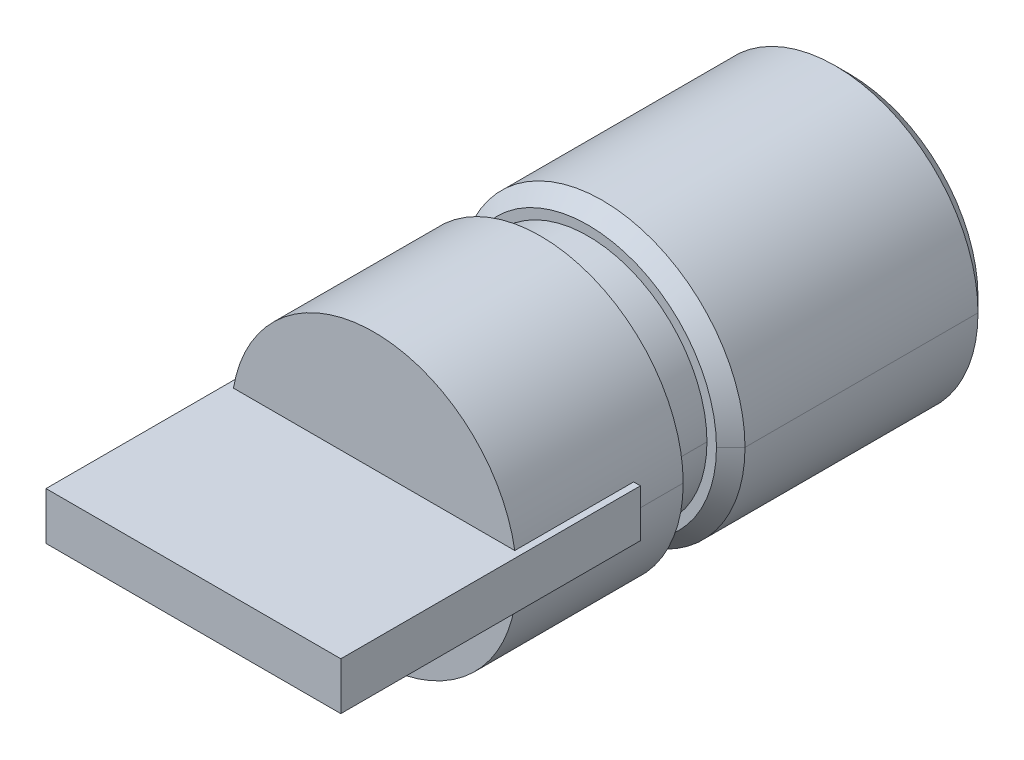
ISO-10303-21;
HEADER;
FILE_DESCRIPTION(('STEP AP214'),'2;1');
FILE_NAME('part.step','',(''),(''),'','','');
FILE_SCHEMA(('AUTOMOTIVE_DESIGN { 1 0 10303 214 1 1 1 1 }'));
ENDSEC;
DATA;
#1=APPLICATION_CONTEXT('core data for automotive mechanical design processes');
#2=APPLICATION_PROTOCOL_DEFINITION('international standard','automotive_design',2000,#1);
#3=PRODUCT_CONTEXT('',#1,'mechanical');
#4=PRODUCT('Part','Part','',(#3));
#5=PRODUCT_RELATED_PRODUCT_CATEGORY('part','',(#4));
#6=PRODUCT_DEFINITION_FORMATION('','',#4);
#7=PRODUCT_DEFINITION_CONTEXT('part definition',#1,'design');
#8=PRODUCT_DEFINITION('design','',#6,#7);
#9=PRODUCT_DEFINITION_SHAPE('','',#8);
#10=(LENGTH_UNIT() NAMED_UNIT(*) SI_UNIT(.MILLI.,.METRE.));
#11=(NAMED_UNIT(*) PLANE_ANGLE_UNIT() SI_UNIT($,.RADIAN.));
#12=(NAMED_UNIT(*) SI_UNIT($,.STERADIAN.) SOLID_ANGLE_UNIT());
#13=UNCERTAINTY_MEASURE_WITH_UNIT(LENGTH_MEASURE(1.E-05),#10,'distance_accuracy_value','');
#14=(GEOMETRIC_REPRESENTATION_CONTEXT(3) GLOBAL_UNCERTAINTY_ASSIGNED_CONTEXT((#13)) GLOBAL_UNIT_ASSIGNED_CONTEXT((#10,
#11,#12)) REPRESENTATION_CONTEXT('',''));
#15=CARTESIAN_POINT('',(0.,0.,0.));
#16=DIRECTION('',(0.,0.,1.));
#17=DIRECTION('',(1.,0.,0.));
#18=AXIS2_PLACEMENT_3D('',#15,#16,#17);
#19=CARTESIAN_POINT('',(0.,0.,0.3));
#20=DIRECTION('',(0.,0.,1.));
#21=DIRECTION('',(1.,0.,0.));
#22=AXIS2_PLACEMENT_3D('',#19,#20,#21);
#23=CONICAL_SURFACE('',#22,3.,0.785398163397448);
#24=DIRECTION('',(-0.707106781186547,0.,0.707106781186548));
#25=VECTOR('',#24,1.);
#26=CARTESIAN_POINT('',(-3.,0.,0.3));
#27=LINE('',#26,#25);
#28=CARTESIAN_POINT('',(-2.7,0.,0.));
#29=VERTEX_POINT('',#28);
#30=CARTESIAN_POINT('',(-3.,0.,0.3));
#31=VERTEX_POINT('',#30);
#32=EDGE_CURVE('P0_E348',#29,#31,#27,.T.);
#33=ORIENTED_EDGE('',*,*,#32,.F.);
#34=CARTESIAN_POINT('',(0.,0.,0.));
#35=DIRECTION('',(0.,0.,-1.));
#36=DIRECTION('',(1.,0.,0.));
#37=AXIS2_PLACEMENT_3D('',#34,#35,#36);
#38=CIRCLE('',#37,2.7);
#39=CARTESIAN_POINT('',(2.7,0.,0.));
#40=VERTEX_POINT('',#39);
#41=EDGE_CURVE('P0_E279',#40,#29,#38,.T.);
#42=ORIENTED_EDGE('',*,*,#41,.F.);
#43=DIRECTION('',(0.707106781186547,0.,0.707106781186548));
#44=VECTOR('',#43,1.);
#45=CARTESIAN_POINT('',(3.,0.,0.3));
#46=LINE('',#45,#44);
#47=CARTESIAN_POINT('',(3.,0.,0.3));
#48=VERTEX_POINT('',#47);
#49=EDGE_CURVE('P0_E194',#40,#48,#46,.T.);
#50=ORIENTED_EDGE('',*,*,#49,.T.);
#51=CARTESIAN_POINT('',(0.,0.,0.3));
#52=DIRECTION('',(0.,0.,1.));
#53=DIRECTION('',(1.,0.,0.));
#54=AXIS2_PLACEMENT_3D('',#51,#52,#53);
#55=CIRCLE('',#54,3.);
#56=EDGE_CURVE('P0_E166',#31,#48,#55,.T.);
#57=ORIENTED_EDGE('',*,*,#56,.F.);
#58=EDGE_LOOP('',(#33,#42,#50,#57));
#59=FACE_BOUND('',#58,.T.);
#60=ADVANCED_FACE('P0_F17',(#59),#23,.T.);
#61=CARTESIAN_POINT('',(0.,0.,5.5));
#62=DIRECTION('',(0.,0.,-1.));
#63=DIRECTION('',(-1.,0.,0.));
#64=AXIS2_PLACEMENT_3D('',#61,#62,#63);
#65=CONICAL_SURFACE('',#64,2.7,0.785398163397449);
#66=DIRECTION('',(0.707106781186548,0.,-0.707106781186547));
#67=VECTOR('',#66,1.);
#68=CARTESIAN_POINT('',(2.7,0.,5.5));
#69=LINE('',#68,#67);
#70=CARTESIAN_POINT('',(2.7,0.,5.5));
#71=VERTEX_POINT('',#70);
#72=CARTESIAN_POINT('',(3.,0.,5.2));
#73=VERTEX_POINT('',#72);
#74=EDGE_CURVE('P0_E157',#71,#73,#69,.T.);
#75=ORIENTED_EDGE('',*,*,#74,.F.);
#76=CARTESIAN_POINT('',(0.,0.,5.5));
#77=DIRECTION('',(0.,0.,1.));
#78=DIRECTION('',(1.,0.,0.));
#79=AXIS2_PLACEMENT_3D('',#76,#77,#78);
#80=CIRCLE('',#79,2.7);
#81=CARTESIAN_POINT('',(-2.7,0.,5.5));
#82=VERTEX_POINT('',#81);
#83=EDGE_CURVE('P0_E273',#82,#71,#80,.T.);
#84=ORIENTED_EDGE('',*,*,#83,.F.);
#85=DIRECTION('',(-0.707106781186548,0.,-0.707106781186547));
#86=VECTOR('',#85,1.);
#87=CARTESIAN_POINT('',(-2.7,0.,5.5));
#88=LINE('',#87,#86);
#89=CARTESIAN_POINT('',(-3.,0.,5.2));
#90=VERTEX_POINT('',#89);
#91=EDGE_CURVE('P0_E160',#82,#90,#88,.T.);
#92=ORIENTED_EDGE('',*,*,#91,.T.);
#93=CARTESIAN_POINT('',(0.,0.,5.2));
#94=DIRECTION('',(0.,0.,-1.));
#95=DIRECTION('',(1.,0.,0.));
#96=AXIS2_PLACEMENT_3D('',#93,#94,#95);
#97=CIRCLE('',#96,3.);
#98=EDGE_CURVE('P0_E153',#73,#90,#97,.T.);
#99=ORIENTED_EDGE('',*,*,#98,.F.);
#100=EDGE_LOOP('',(#75,#84,#92,#99));
#101=FACE_BOUND('',#100,.T.);
#102=ADVANCED_FACE('P0_F155',(#101),#65,.T.);
#103=CARTESIAN_POINT('',(0.,0.,7.5));
#104=DIRECTION('',(0.,0.,1.));
#105=DIRECTION('',(1.,0.,0.));
#106=AXIS2_PLACEMENT_3D('',#103,#104,#105);
#107=PLANE('',#106);
#108=CARTESIAN_POINT('',(0.,0.,7.5));
#109=DIRECTION('',(0.,0.,1.));
#110=DIRECTION('',(1.,0.,0.));
#111=AXIS2_PLACEMENT_3D('',#108,#109,#110);
#112=CIRCLE('',#111,3.);
#113=CARTESIAN_POINT('',(-2.95803989154981,0.5,7.5));
#114=VERTEX_POINT('',#113);
#115=CARTESIAN_POINT('',(-3.,0.,7.5));
#116=VERTEX_POINT('',#115);
#117=EDGE_CURVE('P0_E230',#114,#116,#112,.T.);
#118=ORIENTED_EDGE('',*,*,#117,.T.);
#119=CARTESIAN_POINT('',(0.,0.,7.5));
#120=DIRECTION('',(0.,0.,1.));
#121=DIRECTION('',(1.,0.,0.));
#122=AXIS2_PLACEMENT_3D('',#119,#120,#121);
#123=CIRCLE('',#122,3.);
#124=CARTESIAN_POINT('',(-2.95803989154981,-0.5,7.5));
#125=VERTEX_POINT('',#124);
#126=EDGE_CURVE('P0_E268',#116,#125,#123,.T.);
#127=ORIENTED_EDGE('',*,*,#126,.T.);
#128=DIRECTION('',(1.,0.,0.));
#129=VECTOR('',#128,1.);
#130=CARTESIAN_POINT('',(-2.95803989154981,-0.5,7.5));
#131=LINE('',#130,#129);
#132=CARTESIAN_POINT('',(2.95803989154981,-0.5,7.5));
#133=VERTEX_POINT('',#132);
#134=EDGE_CURVE('P0_E11',#125,#133,#131,.T.);
#135=ORIENTED_EDGE('',*,*,#134,.T.);
#136=CARTESIAN_POINT('',(0.,0.,7.5));
#137=DIRECTION('',(0.,0.,1.));
#138=DIRECTION('',(1.,0.,0.));
#139=AXIS2_PLACEMENT_3D('',#136,#137,#138);
#140=CIRCLE('',#139,3.);
#141=CARTESIAN_POINT('',(3.,0.,7.5));
#142=VERTEX_POINT('',#141);
#143=EDGE_CURVE('P0_E288',#133,#142,#140,.T.);
#144=ORIENTED_EDGE('',*,*,#143,.T.);
#145=CARTESIAN_POINT('',(0.,0.,7.5));
#146=DIRECTION('',(0.,0.,1.));
#147=DIRECTION('',(1.,0.,0.));
#148=AXIS2_PLACEMENT_3D('',#145,#146,#147);
#149=CIRCLE('',#148,3.);
#150=CARTESIAN_POINT('',(2.95803989154981,0.5,7.5));
#151=VERTEX_POINT('',#150);
#152=EDGE_CURVE('P0_E225',#142,#151,#149,.T.);
#153=ORIENTED_EDGE('',*,*,#152,.T.);
#154=DIRECTION('',(-1.,0.,0.));
#155=VECTOR('',#154,1.);
#156=CARTESIAN_POINT('',(-2.95803989154981,0.5,7.5));
#157=LINE('',#156,#155);
#158=EDGE_CURVE('P0_E25',#151,#114,#157,.T.);
#159=ORIENTED_EDGE('',*,*,#158,.T.);
#160=EDGE_LOOP('',(#118,#127,#135,#144,#153,#159));
#161=FACE_BOUND('',#160,.T.);
#162=ADVANCED_FACE('P0_F309',(#161),#107,.T.);
#163=CARTESIAN_POINT('',(-2.95803989154981,-0.5,7.5));
#164=DIRECTION('',(0.,-1.,0.));
#165=DIRECTION('',(0.,0.,-1.));
#166=AXIS2_PLACEMENT_3D('',#163,#164,#165);
#167=PLANE('',#166);
#168=DIRECTION('',(1.,0.,0.));
#169=VECTOR('',#168,1.);
#170=CARTESIAN_POINT('',(-2.95803989154981,-0.5,10.));
#171=LINE('',#170,#169);
#172=CARTESIAN_POINT('',(-2.95803989154981,-0.5,10.));
#173=VERTEX_POINT('',#172);
#174=CARTESIAN_POINT('',(2.95803989154981,-0.5,10.));
#175=VERTEX_POINT('',#174);
#176=EDGE_CURVE('P0_E46',#173,#175,#171,.T.);
#177=ORIENTED_EDGE('',*,*,#176,.T.);
#178=DIRECTION('',(0.,0.,1.));
#179=VECTOR('',#178,1.);
#180=CARTESIAN_POINT('',(2.95803989154981,-0.5,7.5));
#181=LINE('',#180,#179);
#182=EDGE_CURVE('P0_E294',#133,#175,#181,.T.);
#183=ORIENTED_EDGE('',*,*,#182,.F.);
#184=ORIENTED_EDGE('',*,*,#134,.F.);
#185=DIRECTION('',(0.,0.,1.));
#186=VECTOR('',#185,1.);
#187=CARTESIAN_POINT('',(-2.95803989154981,-0.5,7.5));
#188=LINE('',#187,#186);
#189=EDGE_CURVE('P0_E266',#125,#173,#188,.T.);
#190=ORIENTED_EDGE('',*,*,#189,.T.);
#191=EDGE_LOOP('',(#177,#183,#184,#190));
#192=FACE_BOUND('',#191,.T.);
#193=ADVANCED_FACE('P0_F326',(#192),#167,.F.);
#194=CARTESIAN_POINT('',(-2.95803989154981,0.5,7.5));
#195=DIRECTION('',(0.,1.,0.));
#196=DIRECTION('',(1.,0.,0.));
#197=AXIS2_PLACEMENT_3D('',#194,#195,#196);
#198=PLANE('',#197);
#199=DIRECTION('',(-1.,0.,0.));
#200=VECTOR('',#199,1.);
#201=CARTESIAN_POINT('',(-2.95803989154981,0.5,10.));
#202=LINE('',#201,#200);
#203=CARTESIAN_POINT('',(2.95803989154981,0.5,10.));
#204=VERTEX_POINT('',#203);
#205=CARTESIAN_POINT('',(-2.95803989154981,0.5,10.));
#206=VERTEX_POINT('',#205);
#207=EDGE_CURVE('P0_E167',#204,#206,#202,.T.);
#208=ORIENTED_EDGE('',*,*,#207,.T.);
#209=DIRECTION('',(0.,0.,1.));
#210=VECTOR('',#209,1.);
#211=CARTESIAN_POINT('',(-2.95803989154981,0.5,7.5));
#212=LINE('',#211,#210);
#213=EDGE_CURVE('P0_E243',#114,#206,#212,.T.);
#214=ORIENTED_EDGE('',*,*,#213,.F.);
#215=ORIENTED_EDGE('',*,*,#158,.F.);
#216=DIRECTION('',(0.,0.,1.));
#217=VECTOR('',#216,1.);
#218=CARTESIAN_POINT('',(2.95803989154981,0.5,7.5));
#219=LINE('',#218,#217);
#220=EDGE_CURVE('P0_E207',#151,#204,#219,.T.);
#221=ORIENTED_EDGE('',*,*,#220,.T.);
#222=EDGE_LOOP('',(#208,#214,#215,#221));
#223=FACE_BOUND('',#222,.T.);
#224=ADVANCED_FACE('P0_F315',(#223),#198,.F.);
#225=CARTESIAN_POINT('',(0.,0.,2.));
#226=DIRECTION('',(0.,0.,-1.));
#227=DIRECTION('',(0.,-1.,0.));
#228=AXIS2_PLACEMENT_3D('',#225,#226,#227);
#229=PLANE('',#228);
#230=CARTESIAN_POINT('',(0.,0.,2.));
#231=DIRECTION('',(0.,0.,-1.));
#232=DIRECTION('',(-1.,0.,0.));
#233=AXIS2_PLACEMENT_3D('',#230,#231,#232);
#234=CIRCLE('',#233,1.75);
#235=CARTESIAN_POINT('',(-1.75,0.,2.));
#236=VERTEX_POINT('',#235);
#237=CARTESIAN_POINT('',(1.75,0.,2.));
#238=VERTEX_POINT('',#237);
#239=EDGE_CURVE('P0_E302',#236,#238,#234,.T.);
#240=ORIENTED_EDGE('',*,*,#239,.T.);
#241=CARTESIAN_POINT('',(0.,0.,2.));
#242=DIRECTION('',(0.,0.,-1.));
#243=DIRECTION('',(-1.,0.,0.));
#244=AXIS2_PLACEMENT_3D('',#241,#242,#243);
#245=CIRCLE('',#244,1.75);
#246=EDGE_CURVE('P0_E204',#238,#236,#245,.T.);
#247=ORIENTED_EDGE('',*,*,#246,.T.);
#248=EDGE_LOOP('',(#240,#247));
#249=FACE_BOUND('',#248,.T.);
#250=ADVANCED_FACE('P0_F509',(#249),#229,.T.);
#251=CARTESIAN_POINT('',(0.,0.,2.));
#252=DIRECTION('',(0.,0.,-1.));
#253=DIRECTION('',(-1.,0.,0.));
#254=AXIS2_PLACEMENT_3D('',#251,#252,#253);
#255=CYLINDRICAL_SURFACE('',#254,1.75);
#256=DIRECTION('',(0.,0.,-1.));
#257=VECTOR('',#256,1.);
#258=CARTESIAN_POINT('',(1.75,0.,2.));
#259=LINE('',#258,#257);
#260=CARTESIAN_POINT('',(1.75,0.,0.));
#261=VERTEX_POINT('',#260);
#262=EDGE_CURVE('P0_E199',#238,#261,#259,.T.);
#263=ORIENTED_EDGE('',*,*,#262,.F.);
#264=ORIENTED_EDGE('',*,*,#239,.F.);
#265=DIRECTION('',(0.,0.,-1.));
#266=VECTOR('',#265,1.);
#267=CARTESIAN_POINT('',(-1.75,0.,2.));
#268=LINE('',#267,#266);
#269=CARTESIAN_POINT('',(-1.75,0.,0.));
#270=VERTEX_POINT('',#269);
#271=EDGE_CURVE('P0_E219',#236,#270,#268,.T.);
#272=ORIENTED_EDGE('',*,*,#271,.T.);
#273=CARTESIAN_POINT('',(0.,0.,0.));
#274=DIRECTION('',(0.,0.,-1.));
#275=DIRECTION('',(-1.,0.,0.));
#276=AXIS2_PLACEMENT_3D('',#273,#274,#275);
#277=CIRCLE('',#276,1.75);
#278=EDGE_CURVE('P0_E282',#270,#261,#277,.T.);
#279=ORIENTED_EDGE('',*,*,#278,.T.);
#280=EDGE_LOOP('',(#263,#264,#272,#279));
#281=FACE_BOUND('',#280,.T.);
#282=ADVANCED_FACE('P0_F513',(#281),#255,.F.);
#283=CARTESIAN_POINT('',(0.,0.,6.5));
#284=DIRECTION('',(0.,0.,1.));
#285=DIRECTION('',(1.,0.,0.));
#286=AXIS2_PLACEMENT_3D('',#283,#284,#285);
#287=PLANE('',#286);
#288=CARTESIAN_POINT('',(0.,0.,6.5));
#289=DIRECTION('',(0.,0.,1.));
#290=DIRECTION('',(1.,0.,0.));
#291=AXIS2_PLACEMENT_3D('',#288,#289,#290);
#292=CIRCLE('',#291,2.5);
#293=CARTESIAN_POINT('',(-2.5,0.,6.5));
#294=VERTEX_POINT('',#293);
#295=CARTESIAN_POINT('',(2.5,0.,6.5));
#296=VERTEX_POINT('',#295);
#297=EDGE_CURVE('P0_E285',#294,#296,#292,.T.);
#298=ORIENTED_EDGE('',*,*,#297,.T.);
#299=CARTESIAN_POINT('',(0.,0.,6.5));
#300=DIRECTION('',(0.,0.,1.));
#301=DIRECTION('',(1.,0.,0.));
#302=AXIS2_PLACEMENT_3D('',#299,#300,#301);
#303=CIRCLE('',#302,2.5);
#304=EDGE_CURVE('P0_E211',#296,#294,#303,.T.);
#305=ORIENTED_EDGE('',*,*,#304,.T.);
#306=EDGE_LOOP('',(#298,#305));
#307=FACE_BOUND('',#306,.T.);
#308=CARTESIAN_POINT('',(0.,0.,6.5));
#309=DIRECTION('',(0.,0.,1.));
#310=DIRECTION('',(1.,0.,0.));
#311=AXIS2_PLACEMENT_3D('',#308,#309,#310);
#312=CIRCLE('',#311,3.);
#313=CARTESIAN_POINT('',(-3.,0.,6.5));
#314=VERTEX_POINT('',#313);
#315=CARTESIAN_POINT('',(3.,0.,6.5));
#316=VERTEX_POINT('',#315);
#317=EDGE_CURVE('P0_E289',#314,#316,#312,.T.);
#318=ORIENTED_EDGE('',*,*,#317,.F.);
#319=CARTESIAN_POINT('',(0.,0.,6.5));
#320=DIRECTION('',(0.,0.,1.));
#321=DIRECTION('',(1.,0.,0.));
#322=AXIS2_PLACEMENT_3D('',#319,#320,#321);
#323=CIRCLE('',#322,3.);
#324=EDGE_CURVE('P0_E224',#316,#314,#323,.T.);
#325=ORIENTED_EDGE('',*,*,#324,.F.);
#326=EDGE_LOOP('',(#318,#325));
#327=FACE_BOUND('',#326,.T.);
#328=ADVANCED_FACE('P0_F522',(#307,#327),#287,.F.);
#329=CARTESIAN_POINT('',(0.,0.,10.));
#330=DIRECTION('',(0.,0.,1.));
#331=DIRECTION('',(1.,0.,0.));
#332=AXIS2_PLACEMENT_3D('',#329,#330,#331);
#333=PLANE('',#332);
#334=ORIENTED_EDGE('',*,*,#176,.F.);
#335=CARTESIAN_POINT('',(0.,0.,10.));
#336=DIRECTION('',(0.,0.,1.));
#337=DIRECTION('',(1.,0.,0.));
#338=AXIS2_PLACEMENT_3D('',#335,#336,#337);
#339=CIRCLE('',#338,3.);
#340=EDGE_CURVE('P0_E269',#173,#175,#339,.T.);
#341=ORIENTED_EDGE('',*,*,#340,.T.);
#342=EDGE_LOOP('',(#334,#341));
#343=FACE_BOUND('',#342,.T.);
#344=ADVANCED_FACE('P0_F555',(#343),#333,.T.);
#345=CARTESIAN_POINT('',(0.,0.,10.));
#346=DIRECTION('',(0.,0.,-1.));
#347=DIRECTION('',(-1.,0.,0.));
#348=AXIS2_PLACEMENT_3D('',#345,#346,#347);
#349=CYLINDRICAL_SURFACE('',#348,3.);
#350=DIRECTION('',(0.,0.,-1.));
#351=VECTOR('',#350,1.);
#352=CARTESIAN_POINT('',(3.,0.,10.));
#353=LINE('',#352,#351);
#354=EDGE_CURVE('P0_E220',#142,#316,#353,.T.);
#355=ORIENTED_EDGE('',*,*,#354,.F.);
#356=ORIENTED_EDGE('',*,*,#143,.F.);
#357=ORIENTED_EDGE('',*,*,#182,.T.);
#358=ORIENTED_EDGE('',*,*,#340,.F.);
#359=ORIENTED_EDGE('',*,*,#189,.F.);
#360=ORIENTED_EDGE('',*,*,#126,.F.);
#361=DIRECTION('',(0.,0.,-1.));
#362=VECTOR('',#361,1.);
#363=CARTESIAN_POINT('',(-3.,0.,10.));
#364=LINE('',#363,#362);
#365=EDGE_CURVE('P0_E226',#116,#314,#364,.T.);
#366=ORIENTED_EDGE('',*,*,#365,.T.);
#367=ORIENTED_EDGE('',*,*,#317,.T.);
#368=EDGE_LOOP('',(#355,#356,#357,#358,#359,#360,#366,#367));
#369=FACE_BOUND('',#368,.T.);
#370=ADVANCED_FACE('P0_F322',(#369),#349,.T.);
#371=CARTESIAN_POINT('',(0.,0.,6.5));
#372=DIRECTION('',(0.,0.,-1.));
#373=DIRECTION('',(-1.,0.,0.));
#374=AXIS2_PLACEMENT_3D('',#371,#372,#373);
#375=CYLINDRICAL_SURFACE('',#374,2.5);
#376=DIRECTION('',(0.,0.,-1.));
#377=VECTOR('',#376,1.);
#378=CARTESIAN_POINT('',(2.5,0.,6.5));
#379=LINE('',#378,#377);
#380=CARTESIAN_POINT('',(2.5,0.,5.5));
#381=VERTEX_POINT('',#380);
#382=EDGE_CURVE('P0_E253',#296,#381,#379,.T.);
#383=ORIENTED_EDGE('',*,*,#382,.F.);
#384=ORIENTED_EDGE('',*,*,#297,.F.);
#385=DIRECTION('',(0.,0.,-1.));
#386=VECTOR('',#385,1.);
#387=CARTESIAN_POINT('',(-2.5,0.,6.5));
#388=LINE('',#387,#386);
#389=CARTESIAN_POINT('',(-2.5,0.,5.5));
#390=VERTEX_POINT('',#389);
#391=EDGE_CURVE('P0_E178',#294,#390,#388,.T.);
#392=ORIENTED_EDGE('',*,*,#391,.T.);
#393=CARTESIAN_POINT('',(0.,0.,5.5));
#394=DIRECTION('',(0.,0.,1.));
#395=DIRECTION('',(1.,0.,0.));
#396=AXIS2_PLACEMENT_3D('',#393,#394,#395);
#397=CIRCLE('',#396,2.5);
#398=EDGE_CURVE('P0_E276',#390,#381,#397,.T.);
#399=ORIENTED_EDGE('',*,*,#398,.T.);
#400=EDGE_LOOP('',(#383,#384,#392,#399));
#401=FACE_BOUND('',#400,.T.);
#402=ADVANCED_FACE('P0_F554',(#401),#375,.T.);
#403=CARTESIAN_POINT('',(0.,0.,0.));
#404=DIRECTION('',(0.,0.,1.));
#405=DIRECTION('',(1.,0.,0.));
#406=AXIS2_PLACEMENT_3D('',#403,#404,#405);
#407=PLANE('',#406);
#408=ORIENTED_EDGE('',*,*,#278,.F.);
#409=CARTESIAN_POINT('',(0.,0.,0.));
#410=DIRECTION('',(0.,0.,-1.));
#411=DIRECTION('',(-1.,0.,0.));
#412=AXIS2_PLACEMENT_3D('',#409,#410,#411);
#413=CIRCLE('',#412,1.75);
#414=EDGE_CURVE('P0_E203',#261,#270,#413,.T.);
#415=ORIENTED_EDGE('',*,*,#414,.F.);
#416=EDGE_LOOP('',(#408,#415));
#417=FACE_BOUND('',#416,.T.);
#418=ORIENTED_EDGE('',*,*,#41,.T.);
#419=CARTESIAN_POINT('',(0.,0.,0.));
#420=DIRECTION('',(0.,0.,-1.));
#421=DIRECTION('',(1.,0.,0.));
#422=AXIS2_PLACEMENT_3D('',#419,#420,#421);
#423=CIRCLE('',#422,2.7);
#424=EDGE_CURVE('P0_E355',#29,#40,#423,.T.);
#425=ORIENTED_EDGE('',*,*,#424,.T.);
#426=EDGE_LOOP('',(#418,#425));
#427=FACE_BOUND('',#426,.T.);
#428=ADVANCED_FACE('P0_F575',(#417,#427),#407,.F.);
#429=CARTESIAN_POINT('',(0.,0.,5.5));
#430=DIRECTION('',(0.,0.,1.));
#431=DIRECTION('',(1.,0.,0.));
#432=AXIS2_PLACEMENT_3D('',#429,#430,#431);
#433=PLANE('',#432);
#434=ORIENTED_EDGE('',*,*,#398,.F.);
#435=CARTESIAN_POINT('',(0.,0.,5.5));
#436=DIRECTION('',(0.,0.,1.));
#437=DIRECTION('',(1.,0.,0.));
#438=AXIS2_PLACEMENT_3D('',#435,#436,#437);
#439=CIRCLE('',#438,2.5);
#440=EDGE_CURVE('P0_E257',#381,#390,#439,.T.);
#441=ORIENTED_EDGE('',*,*,#440,.F.);
#442=EDGE_LOOP('',(#434,#441));
#443=FACE_BOUND('',#442,.T.);
#444=ORIENTED_EDGE('',*,*,#83,.T.);
#445=CARTESIAN_POINT('',(0.,0.,5.5));
#446=DIRECTION('',(0.,0.,1.));
#447=DIRECTION('',(1.,0.,0.));
#448=AXIS2_PLACEMENT_3D('',#445,#446,#447);
#449=CIRCLE('',#448,2.7);
#450=EDGE_CURVE('P0_E187',#71,#82,#449,.T.);
#451=ORIENTED_EDGE('',*,*,#450,.T.);
#452=EDGE_LOOP('',(#444,#451));
#453=FACE_BOUND('',#452,.T.);
#454=ADVANCED_FACE('P0_F338',(#443,#453),#433,.T.);
#455=CARTESIAN_POINT('',(0.,0.,5.5));
#456=DIRECTION('',(0.,0.,-1.));
#457=DIRECTION('',(-1.,0.,0.));
#458=AXIS2_PLACEMENT_3D('',#455,#456,#457);
#459=CYLINDRICAL_SURFACE('',#458,3.);
#460=DIRECTION('',(0.,0.,-1.));
#461=VECTOR('',#460,1.);
#462=CARTESIAN_POINT('',(3.,0.,5.5));
#463=LINE('',#462,#461);
#464=EDGE_CURVE('P0_E170',#73,#48,#463,.T.);
#465=ORIENTED_EDGE('',*,*,#464,.F.);
#466=ORIENTED_EDGE('',*,*,#98,.T.);
#467=DIRECTION('',(0.,0.,-1.));
#468=VECTOR('',#467,1.);
#469=CARTESIAN_POINT('',(-3.,0.,5.5));
#470=LINE('',#469,#468);
#471=EDGE_CURVE('P0_E177',#90,#31,#470,.T.);
#472=ORIENTED_EDGE('',*,*,#471,.T.);
#473=ORIENTED_EDGE('',*,*,#56,.T.);
#474=EDGE_LOOP('',(#465,#466,#472,#473));
#475=FACE_BOUND('',#474,.T.);
#476=ADVANCED_FACE('P0_F172',(#475),#459,.T.);
#477=CARTESIAN_POINT('',(0.,0.,10.));
#478=DIRECTION('',(0.,0.,1.));
#479=DIRECTION('',(1.,0.,0.));
#480=AXIS2_PLACEMENT_3D('',#477,#478,#479);
#481=PLANE('',#480);
#482=ORIENTED_EDGE('',*,*,#207,.F.);
#483=CARTESIAN_POINT('',(0.,0.,10.));
#484=DIRECTION('',(0.,0.,1.));
#485=DIRECTION('',(1.,0.,0.));
#486=AXIS2_PLACEMENT_3D('',#483,#484,#485);
#487=CIRCLE('',#486,3.);
#488=EDGE_CURVE('P0_E212',#204,#206,#487,.T.);
#489=ORIENTED_EDGE('',*,*,#488,.T.);
#490=EDGE_LOOP('',(#482,#489));
#491=FACE_BOUND('',#490,.T.);
#492=ADVANCED_FACE('P0_F328',(#491),#481,.T.);
#493=CARTESIAN_POINT('',(0.,0.,5.5));
#494=DIRECTION('',(0.,0.,-1.));
#495=DIRECTION('',(-1.,0.,0.));
#496=AXIS2_PLACEMENT_3D('',#493,#494,#495);
#497=CYLINDRICAL_SURFACE('',#496,3.);
#498=CARTESIAN_POINT('',(0.,0.,5.2));
#499=DIRECTION('',(0.,0.,-1.));
#500=DIRECTION('',(1.,0.,0.));
#501=AXIS2_PLACEMENT_3D('',#498,#499,#500);
#502=CIRCLE('',#501,3.);
#503=EDGE_CURVE('P0_E180',#90,#73,#502,.T.);
#504=ORIENTED_EDGE('',*,*,#503,.T.);
#505=ORIENTED_EDGE('',*,*,#464,.T.);
#506=CARTESIAN_POINT('',(0.,0.,0.3));
#507=DIRECTION('',(0.,0.,1.));
#508=DIRECTION('',(1.,0.,0.));
#509=AXIS2_PLACEMENT_3D('',#506,#507,#508);
#510=CIRCLE('',#509,3.);
#511=EDGE_CURVE('P0_E354',#48,#31,#510,.T.);
#512=ORIENTED_EDGE('',*,*,#511,.T.);
#513=ORIENTED_EDGE('',*,*,#471,.F.);
#514=EDGE_LOOP('',(#504,#505,#512,#513));
#515=FACE_BOUND('',#514,.T.);
#516=ADVANCED_FACE('P0_F181',(#515),#497,.T.);
#517=CARTESIAN_POINT('',(0.,0.,6.5));
#518=DIRECTION('',(0.,0.,-1.));
#519=DIRECTION('',(-1.,0.,0.));
#520=AXIS2_PLACEMENT_3D('',#517,#518,#519);
#521=CYLINDRICAL_SURFACE('',#520,2.5);
#522=ORIENTED_EDGE('',*,*,#304,.F.);
#523=ORIENTED_EDGE('',*,*,#382,.T.);
#524=ORIENTED_EDGE('',*,*,#440,.T.);
#525=ORIENTED_EDGE('',*,*,#391,.F.);
#526=EDGE_LOOP('',(#522,#523,#524,#525));
#527=FACE_BOUND('',#526,.T.);
#528=ADVANCED_FACE('P0_F336',(#527),#521,.T.);
#529=CARTESIAN_POINT('',(0.,0.,10.));
#530=DIRECTION('',(0.,0.,-1.));
#531=DIRECTION('',(-1.,0.,0.));
#532=AXIS2_PLACEMENT_3D('',#529,#530,#531);
#533=CYLINDRICAL_SURFACE('',#532,3.);
#534=ORIENTED_EDGE('',*,*,#152,.F.);
#535=ORIENTED_EDGE('',*,*,#354,.T.);
#536=ORIENTED_EDGE('',*,*,#324,.T.);
#537=ORIENTED_EDGE('',*,*,#365,.F.);
#538=ORIENTED_EDGE('',*,*,#117,.F.);
#539=ORIENTED_EDGE('',*,*,#213,.T.);
#540=ORIENTED_EDGE('',*,*,#488,.F.);
#541=ORIENTED_EDGE('',*,*,#220,.F.);
#542=EDGE_LOOP('',(#534,#535,#536,#537,#538,#539,#540,#541));
#543=FACE_BOUND('',#542,.T.);
#544=ADVANCED_FACE('P0_F318',(#543),#533,.T.);
#545=CARTESIAN_POINT('',(0.,0.,2.));
#546=DIRECTION('',(0.,0.,-1.));
#547=DIRECTION('',(-1.,0.,0.));
#548=AXIS2_PLACEMENT_3D('',#545,#546,#547);
#549=CYLINDRICAL_SURFACE('',#548,1.75);
#550=ORIENTED_EDGE('',*,*,#246,.F.);
#551=ORIENTED_EDGE('',*,*,#262,.T.);
#552=ORIENTED_EDGE('',*,*,#414,.T.);
#553=ORIENTED_EDGE('',*,*,#271,.F.);
#554=EDGE_LOOP('',(#550,#551,#552,#553));
#555=FACE_BOUND('',#554,.T.);
#556=ADVANCED_FACE('P0_F504',(#555),#549,.F.);
#557=CARTESIAN_POINT('',(0.,0.,5.5));
#558=DIRECTION('',(0.,0.,-1.));
#559=DIRECTION('',(-1.,0.,0.));
#560=AXIS2_PLACEMENT_3D('',#557,#558,#559);
#561=CONICAL_SURFACE('',#560,2.7,0.785398163397449);
#562=ORIENTED_EDGE('',*,*,#450,.F.);
#563=ORIENTED_EDGE('',*,*,#74,.T.);
#564=ORIENTED_EDGE('',*,*,#503,.F.);
#565=ORIENTED_EDGE('',*,*,#91,.F.);
#566=EDGE_LOOP('',(#562,#563,#564,#565));
#567=FACE_BOUND('',#566,.T.);
#568=ADVANCED_FACE('P0_F185',(#567),#561,.T.);
#569=CARTESIAN_POINT('',(0.,0.,0.3));
#570=DIRECTION('',(0.,0.,1.));
#571=DIRECTION('',(1.,0.,0.));
#572=AXIS2_PLACEMENT_3D('',#569,#570,#571);
#573=CONICAL_SURFACE('',#572,3.,0.785398163397448);
#574=ORIENTED_EDGE('',*,*,#424,.F.);
#575=ORIENTED_EDGE('',*,*,#32,.T.);
#576=ORIENTED_EDGE('',*,*,#511,.F.);
#577=ORIENTED_EDGE('',*,*,#49,.F.);
#578=EDGE_LOOP('',(#574,#575,#576,#577));
#579=FACE_BOUND('',#578,.T.);
#580=ADVANCED_FACE('P0_F358',(#579),#573,.T.);
#581=CLOSED_SHELL('',(#60,#102,#162,#193,#224,#250,#282,#328,#344,#370,#402,#428,#454,#476,#492,
#516,#528,#544,#556,#568,#580));
#582=MANIFOLD_SOLID_BREP('P0_B1',#581);
#583=CARTESIAN_POINT('',(0.,0.,7.5));
#584=DIRECTION('',(0.,0.,1.));
#585=DIRECTION('',(1.,0.,0.));
#586=AXIS2_PLACEMENT_3D('',#583,#584,#585);
#587=PLANE('',#586);
#588=DIRECTION('',(0.,-1.,0.));
#589=VECTOR('',#588,1.);
#590=CARTESIAN_POINT('',(-3.1,0.5,7.5));
#591=LINE('',#590,#589);
#592=CARTESIAN_POINT('',(-3.1,0.5,7.5));
#593=VERTEX_POINT('',#592);
#594=CARTESIAN_POINT('',(-3.1,-0.5,7.5));
#595=VERTEX_POINT('',#594);
#596=EDGE_CURVE('P1_E110',#593,#595,#591,.T.);
#597=ORIENTED_EDGE('',*,*,#596,.F.);
#598=DIRECTION('',(-1.,0.,0.));
#599=VECTOR('',#598,1.);
#600=CARTESIAN_POINT('',(2.95803989154981,0.5,7.5));
#601=LINE('',#600,#599);
#602=CARTESIAN_POINT('',(3.1,0.5,7.5));
#603=VERTEX_POINT('',#602);
#604=EDGE_CURVE('P1_E25',#603,#593,#601,.T.);
#605=ORIENTED_EDGE('',*,*,#604,.F.);
#606=DIRECTION('',(0.,1.,0.));
#607=VECTOR('',#606,1.);
#608=CARTESIAN_POINT('',(3.1,0.5,7.5));
#609=LINE('',#608,#607);
#610=CARTESIAN_POINT('',(3.1,-0.5,7.5));
#611=VERTEX_POINT('',#610);
#612=EDGE_CURVE('P1_E55',#611,#603,#609,.T.);
#613=ORIENTED_EDGE('',*,*,#612,.F.);
#614=DIRECTION('',(1.,0.,0.));
#615=VECTOR('',#614,1.);
#616=CARTESIAN_POINT('',(-3.1,-0.5,7.5));
#617=LINE('',#616,#615);
#618=EDGE_CURVE('P1_E85',#595,#611,#617,.T.);
#619=ORIENTED_EDGE('',*,*,#618,.F.);
#620=EDGE_LOOP('',(#597,#605,#613,#619));
#621=FACE_BOUND('',#620,.T.);
#622=ADVANCED_FACE('P1_F16',(#621),#587,.F.);
#623=CARTESIAN_POINT('',(0.,0.,13.8));
#624=DIRECTION('',(0.,0.,1.));
#625=DIRECTION('',(1.,0.,0.));
#626=AXIS2_PLACEMENT_3D('',#623,#624,#625);
#627=PLANE('',#626);
#628=DIRECTION('',(-1.,0.,0.));
#629=VECTOR('',#628,1.);
#630=CARTESIAN_POINT('',(2.95803989154981,0.5,13.8));
#631=LINE('',#630,#629);
#632=CARTESIAN_POINT('',(3.1,0.5,13.8));
#633=VERTEX_POINT('',#632);
#634=CARTESIAN_POINT('',(-3.1,0.5,13.8));
#635=VERTEX_POINT('',#634);
#636=EDGE_CURVE('P1_E10',#633,#635,#631,.T.);
#637=ORIENTED_EDGE('',*,*,#636,.T.);
#638=DIRECTION('',(0.,-1.,0.));
#639=VECTOR('',#638,1.);
#640=CARTESIAN_POINT('',(-3.1,0.5,13.8));
#641=LINE('',#640,#639);
#642=CARTESIAN_POINT('',(-3.1,-0.5,13.8));
#643=VERTEX_POINT('',#642);
#644=EDGE_CURVE('P1_E79',#635,#643,#641,.T.);
#645=ORIENTED_EDGE('',*,*,#644,.T.);
#646=DIRECTION('',(1.,0.,0.));
#647=VECTOR('',#646,1.);
#648=CARTESIAN_POINT('',(-3.1,-0.5,13.8));
#649=LINE('',#648,#647);
#650=CARTESIAN_POINT('',(3.1,-0.5,13.8));
#651=VERTEX_POINT('',#650);
#652=EDGE_CURVE('P1_E76',#643,#651,#649,.T.);
#653=ORIENTED_EDGE('',*,*,#652,.T.);
#654=DIRECTION('',(0.,1.,0.));
#655=VECTOR('',#654,1.);
#656=CARTESIAN_POINT('',(3.1,0.5,13.8));
#657=LINE('',#656,#655);
#658=EDGE_CURVE('P1_E64',#651,#633,#657,.T.);
#659=ORIENTED_EDGE('',*,*,#658,.T.);
#660=EDGE_LOOP('',(#637,#645,#653,#659));
#661=FACE_BOUND('',#660,.T.);
#662=ADVANCED_FACE('P1_F77',(#661),#627,.T.);
#663=CARTESIAN_POINT('',(2.95803989154981,0.5,13.8));
#664=DIRECTION('',(0.,-1.,0.));
#665=DIRECTION('',(0.,0.,-1.));
#666=AXIS2_PLACEMENT_3D('',#663,#664,#665);
#667=PLANE('',#666);
#668=ORIENTED_EDGE('',*,*,#604,.T.);
#669=DIRECTION('',(0.,0.,-1.));
#670=VECTOR('',#669,1.);
#671=CARTESIAN_POINT('',(-3.1,0.5,13.8));
#672=LINE('',#671,#670);
#673=EDGE_CURVE('P1_E92',#635,#593,#672,.T.);
#674=ORIENTED_EDGE('',*,*,#673,.F.);
#675=ORIENTED_EDGE('',*,*,#636,.F.);
#676=DIRECTION('',(0.,0.,-1.));
#677=VECTOR('',#676,1.);
#678=CARTESIAN_POINT('',(3.1,0.5,13.8));
#679=LINE('',#678,#677);
#680=EDGE_CURVE('P1_E70',#633,#603,#679,.T.);
#681=ORIENTED_EDGE('',*,*,#680,.T.);
#682=EDGE_LOOP('',(#668,#674,#675,#681));
#683=FACE_BOUND('',#682,.T.);
#684=ADVANCED_FACE('P1_F177',(#683),#667,.F.);
#685=CARTESIAN_POINT('',(3.1,0.5,13.8));
#686=DIRECTION('',(-1.,0.,0.));
#687=DIRECTION('',(0.,0.,1.));
#688=AXIS2_PLACEMENT_3D('',#685,#686,#687);
#689=PLANE('',#688);
#690=ORIENTED_EDGE('',*,*,#612,.T.);
#691=ORIENTED_EDGE('',*,*,#680,.F.);
#692=ORIENTED_EDGE('',*,*,#658,.F.);
#693=DIRECTION('',(0.,0.,-1.));
#694=VECTOR('',#693,1.);
#695=CARTESIAN_POINT('',(3.1,-0.5,13.8));
#696=LINE('',#695,#694);
#697=EDGE_CURVE('P1_E68',#651,#611,#696,.T.);
#698=ORIENTED_EDGE('',*,*,#697,.T.);
#699=EDGE_LOOP('',(#690,#691,#692,#698));
#700=FACE_BOUND('',#699,.T.);
#701=ADVANCED_FACE('P1_F66',(#700),#689,.F.);
#702=CARTESIAN_POINT('',(-3.1,-0.5,13.8));
#703=DIRECTION('',(0.,1.,0.));
#704=DIRECTION('',(1.,0.,0.));
#705=AXIS2_PLACEMENT_3D('',#702,#703,#704);
#706=PLANE('',#705);
#707=ORIENTED_EDGE('',*,*,#618,.T.);
#708=ORIENTED_EDGE('',*,*,#697,.F.);
#709=ORIENTED_EDGE('',*,*,#652,.F.);
#710=DIRECTION('',(0.,0.,-1.));
#711=VECTOR('',#710,1.);
#712=CARTESIAN_POINT('',(-3.1,-0.5,13.8));
#713=LINE('',#712,#711);
#714=EDGE_CURVE('P1_E108',#643,#595,#713,.T.);
#715=ORIENTED_EDGE('',*,*,#714,.T.);
#716=EDGE_LOOP('',(#707,#708,#709,#715));
#717=FACE_BOUND('',#716,.T.);
#718=ADVANCED_FACE('P1_F84',(#717),#706,.F.);
#719=CARTESIAN_POINT('',(-3.1,0.5,13.8));
#720=DIRECTION('',(1.,0.,0.));
#721=DIRECTION('',(0.,1.,0.));
#722=AXIS2_PLACEMENT_3D('',#719,#720,#721);
#723=PLANE('',#722);
#724=ORIENTED_EDGE('',*,*,#596,.T.);
#725=ORIENTED_EDGE('',*,*,#714,.F.);
#726=ORIENTED_EDGE('',*,*,#644,.F.);
#727=ORIENTED_EDGE('',*,*,#673,.T.);
#728=EDGE_LOOP('',(#724,#725,#726,#727));
#729=FACE_BOUND('',#728,.T.);
#730=ADVANCED_FACE('P1_F120',(#729),#723,.F.);
#731=CLOSED_SHELL('',(#622,#662,#684,#701,#718,#730));
#732=MANIFOLD_SOLID_BREP('P1_B1',#731);
#733=ADVANCED_BREP_SHAPE_REPRESENTATION('',(#18,#582,#732),#14);
#734=SHAPE_DEFINITION_REPRESENTATION(#9,#733);
ENDSEC;
END-ISO-10303-21;
